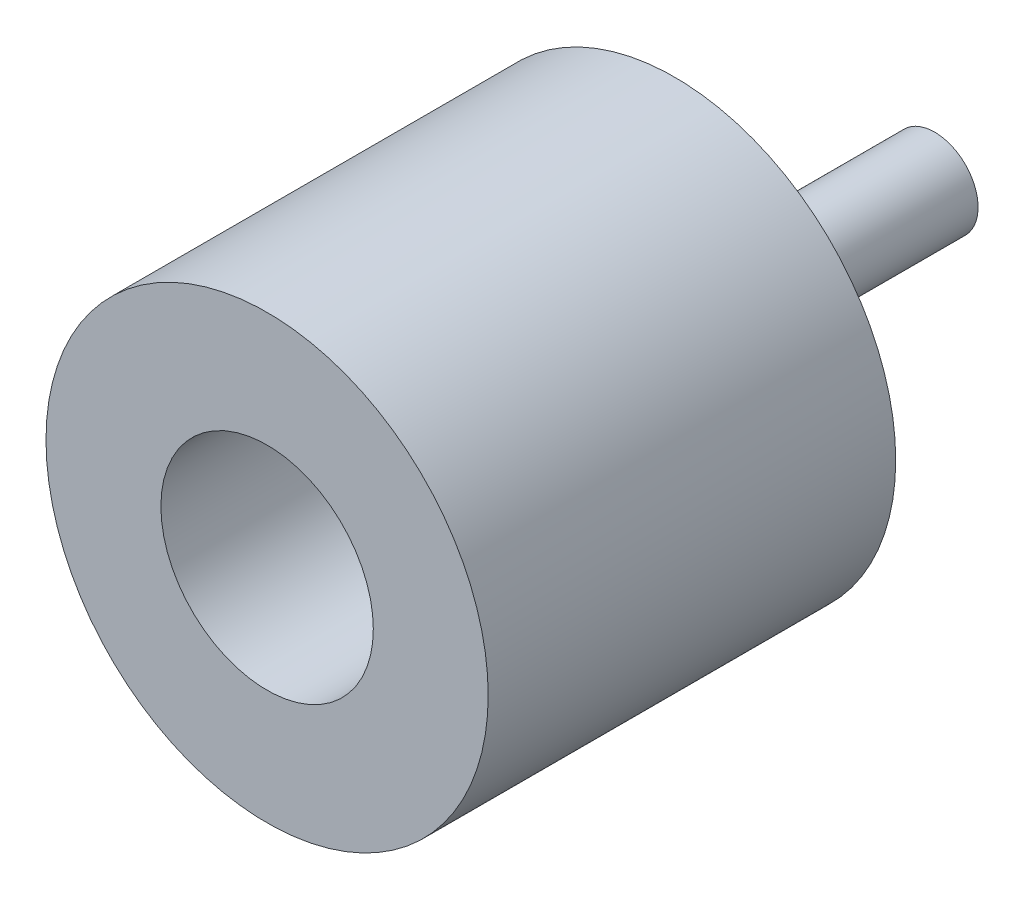
ISO-10303-21;
HEADER;
FILE_DESCRIPTION(('STEP AP214'),'2;1');
FILE_NAME('part.step','',(''),(''),'','','');
FILE_SCHEMA(('AUTOMOTIVE_DESIGN { 1 0 10303 214 1 1 1 1 }'));
ENDSEC;
DATA;
#1=APPLICATION_CONTEXT('core data for automotive mechanical design processes');
#2=APPLICATION_PROTOCOL_DEFINITION('international standard','automotive_design',2000,#1);
#3=PRODUCT_CONTEXT('',#1,'mechanical');
#4=PRODUCT('Part','Part','',(#3));
#5=PRODUCT_RELATED_PRODUCT_CATEGORY('part','',(#4));
#6=PRODUCT_DEFINITION_FORMATION('','',#4);
#7=PRODUCT_DEFINITION_CONTEXT('part definition',#1,'design');
#8=PRODUCT_DEFINITION('design','',#6,#7);
#9=PRODUCT_DEFINITION_SHAPE('','',#8);
#10=(LENGTH_UNIT() NAMED_UNIT(*) SI_UNIT(.MILLI.,.METRE.));
#11=(NAMED_UNIT(*) PLANE_ANGLE_UNIT() SI_UNIT($,.RADIAN.));
#12=(NAMED_UNIT(*) SI_UNIT($,.STERADIAN.) SOLID_ANGLE_UNIT());
#13=UNCERTAINTY_MEASURE_WITH_UNIT(LENGTH_MEASURE(1.E-05),#10,'distance_accuracy_value','');
#14=(GEOMETRIC_REPRESENTATION_CONTEXT(3) GLOBAL_UNCERTAINTY_ASSIGNED_CONTEXT((#13)) GLOBAL_UNIT_ASSIGNED_CONTEXT((#10,
#11,#12)) REPRESENTATION_CONTEXT('',''));
#15=CARTESIAN_POINT('',(0.,0.,0.));
#16=DIRECTION('',(0.,0.,1.));
#17=DIRECTION('',(1.,0.,0.));
#18=AXIS2_PLACEMENT_3D('',#15,#16,#17);
#19=CARTESIAN_POINT('',(0.,0.,-5.36050396448853));
#20=DIRECTION('',(0.,0.,-1.));
#21=DIRECTION('',(-1.,0.,0.));
#22=AXIS2_PLACEMENT_3D('',#19,#20,#21);
#23=CYLINDRICAL_SURFACE('',#22,2.55);
#24=CARTESIAN_POINT('',(0.,0.,-4.5));
#25=DIRECTION('',(0.,0.,-1.));
#26=DIRECTION('',(-1.,0.,0.));
#27=AXIS2_PLACEMENT_3D('',#24,#25,#26);
#28=CIRCLE('',#27,2.55);
#29=CARTESIAN_POINT('',(-2.55,0.,-4.5));
#30=VERTEX_POINT('',#29);
#31=EDGE_CURVE('E10',#30,#30,#28,.T.);
#32=ORIENTED_EDGE('',*,*,#31,.F.);
#33=EDGE_LOOP('',(#32));
#34=FACE_BOUND('',#33,.T.);
#35=CARTESIAN_POINT('',(0.,0.,0.2));
#36=DIRECTION('',(0.,0.,-1.));
#37=DIRECTION('',(-1.,0.,0.));
#38=AXIS2_PLACEMENT_3D('',#35,#36,#37);
#39=CIRCLE('',#38,2.55);
#40=CARTESIAN_POINT('',(-2.55,0.,0.2));
#41=VERTEX_POINT('',#40);
#42=EDGE_CURVE('E53',#41,#41,#39,.T.);
#43=ORIENTED_EDGE('',*,*,#42,.T.);
#44=EDGE_LOOP('',(#43));
#45=FACE_BOUND('',#44,.T.);
#46=ADVANCED_FACE('F31',(#34,#45),#23,.T.);
#47=CARTESIAN_POINT('',(2.55,0.,-4.5));
#48=DIRECTION('',(0.,0.,1.));
#49=DIRECTION('',(1.,0.,0.));
#50=AXIS2_PLACEMENT_3D('',#47,#48,#49);
#51=PLANE('',#50);
#52=CARTESIAN_POINT('',(0.,0.,-4.5));
#53=DIRECTION('',(0.,0.,-1.));
#54=DIRECTION('',(-1.,0.,0.));
#55=AXIS2_PLACEMENT_3D('',#52,#53,#54);
#56=CIRCLE('',#55,0.499999999999998);
#57=CARTESIAN_POINT('',(-0.499999999999998,0.,-4.5));
#58=VERTEX_POINT('',#57);
#59=EDGE_CURVE('E37',#58,#58,#56,.T.);
#60=ORIENTED_EDGE('',*,*,#59,.F.);
#61=EDGE_LOOP('',(#60));
#62=FACE_BOUND('',#61,.T.);
#63=ORIENTED_EDGE('',*,*,#31,.T.);
#64=EDGE_LOOP('',(#63));
#65=FACE_BOUND('',#64,.T.);
#66=ADVANCED_FACE('F81',(#62,#65),#51,.F.);
#67=CARTESIAN_POINT('',(0.,0.,-5.36050396448853));
#68=DIRECTION('',(0.,0.,-1.));
#69=DIRECTION('',(-1.,0.,0.));
#70=AXIS2_PLACEMENT_3D('',#67,#68,#69);
#71=CYLINDRICAL_SURFACE('',#70,0.499999999999998);
#72=CARTESIAN_POINT('',(0.,0.,-7.5));
#73=DIRECTION('',(0.,0.,-1.));
#74=DIRECTION('',(-1.,0.,0.));
#75=AXIS2_PLACEMENT_3D('',#72,#73,#74);
#76=CIRCLE('',#75,0.499999999999998);
#77=CARTESIAN_POINT('',(-0.499999999999997,0.,-7.5));
#78=VERTEX_POINT('',#77);
#79=EDGE_CURVE('E41',#78,#78,#76,.T.);
#80=ORIENTED_EDGE('',*,*,#79,.F.);
#81=EDGE_LOOP('',(#80));
#82=FACE_BOUND('',#81,.T.);
#83=ORIENTED_EDGE('',*,*,#59,.T.);
#84=EDGE_LOOP('',(#83));
#85=FACE_BOUND('',#84,.T.);
#86=ADVANCED_FACE('F77',(#82,#85),#71,.T.);
#87=CARTESIAN_POINT('',(0.499999999999998,0.,-7.5));
#88=DIRECTION('',(0.,0.,1.));
#89=DIRECTION('',(1.,0.,0.));
#90=AXIS2_PLACEMENT_3D('',#87,#88,#89);
#91=PLANE('',#90);
#92=ORIENTED_EDGE('',*,*,#79,.T.);
#93=EDGE_LOOP('',(#92));
#94=FACE_BOUND('',#93,.T.);
#95=ADVANCED_FACE('F72',(#94),#91,.F.);
#96=CARTESIAN_POINT('',(0.,0.,-3.5));
#97=DIRECTION('',(0.,0.,-1.));
#98=DIRECTION('',(-1.,0.,0.));
#99=AXIS2_PLACEMENT_3D('',#96,#97,#98);
#100=PLANE('',#99);
#101=CARTESIAN_POINT('',(0.,0.,-3.5));
#102=DIRECTION('',(0.,0.,-1.));
#103=DIRECTION('',(-1.,0.,0.));
#104=AXIS2_PLACEMENT_3D('',#101,#102,#103);
#105=CIRCLE('',#104,1.225);
#106=CARTESIAN_POINT('',(-1.225,0.,-3.5));
#107=VERTEX_POINT('',#106);
#108=EDGE_CURVE('E45',#107,#107,#105,.T.);
#109=ORIENTED_EDGE('',*,*,#108,.F.);
#110=EDGE_LOOP('',(#109));
#111=FACE_BOUND('',#110,.T.);
#112=ADVANCED_FACE('F67',(#111),#100,.F.);
#113=CARTESIAN_POINT('',(0.,0.,-5.36050396448853));
#114=DIRECTION('',(0.,0.,-1.));
#115=DIRECTION('',(-1.,0.,0.));
#116=AXIS2_PLACEMENT_3D('',#113,#114,#115);
#117=CYLINDRICAL_SURFACE('',#116,1.225);
#118=CARTESIAN_POINT('',(0.,0.,0.2));
#119=DIRECTION('',(0.,0.,-1.));
#120=DIRECTION('',(-1.,0.,0.));
#121=AXIS2_PLACEMENT_3D('',#118,#119,#120);
#122=CIRCLE('',#121,1.225);
#123=CARTESIAN_POINT('',(-1.225,0.,0.2));
#124=VERTEX_POINT('',#123);
#125=EDGE_CURVE('E50',#124,#124,#122,.T.);
#126=ORIENTED_EDGE('',*,*,#125,.F.);
#127=EDGE_LOOP('',(#126));
#128=FACE_BOUND('',#127,.T.);
#129=ORIENTED_EDGE('',*,*,#108,.T.);
#130=EDGE_LOOP('',(#129));
#131=FACE_BOUND('',#130,.T.);
#132=ADVANCED_FACE('F61',(#128,#131),#117,.F.);
#133=CARTESIAN_POINT('',(1.225,0.,0.2));
#134=DIRECTION('',(0.,0.,-1.));
#135=DIRECTION('',(-1.,0.,0.));
#136=AXIS2_PLACEMENT_3D('',#133,#134,#135);
#137=PLANE('',#136);
#138=ORIENTED_EDGE('',*,*,#42,.F.);
#139=EDGE_LOOP('',(#138));
#140=FACE_BOUND('',#139,.T.);
#141=ORIENTED_EDGE('',*,*,#125,.T.);
#142=EDGE_LOOP('',(#141));
#143=FACE_BOUND('',#142,.T.);
#144=ADVANCED_FACE('F58',(#140,#143),#137,.F.);
#145=CLOSED_SHELL('',(#46,#66,#86,#95,#112,#132,#144));
#146=MANIFOLD_SOLID_BREP('B2',#145);
#147=ADVANCED_BREP_SHAPE_REPRESENTATION('',(#18,#146),#14);
#148=SHAPE_DEFINITION_REPRESENTATION(#9,#147);
ENDSEC;
END-ISO-10303-21;
